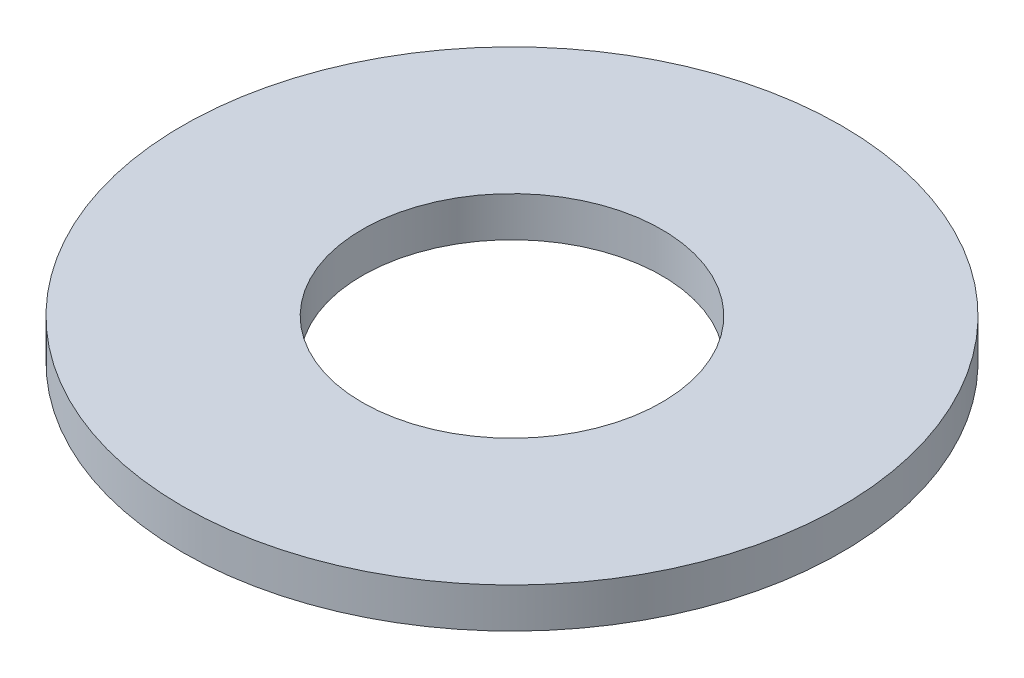
ISO-10303-21;
HEADER;
FILE_DESCRIPTION(('STEP AP214'),'2;1');
FILE_NAME('part.step','',(''),(''),'','','');
FILE_SCHEMA(('AUTOMOTIVE_DESIGN { 1 0 10303 214 1 1 1 1 }'));
ENDSEC;
DATA;
#1=APPLICATION_CONTEXT('core data for automotive mechanical design processes');
#2=APPLICATION_PROTOCOL_DEFINITION('international standard','automotive_design',2000,#1);
#3=PRODUCT_CONTEXT('',#1,'mechanical');
#4=PRODUCT('Part','Part','',(#3));
#5=PRODUCT_RELATED_PRODUCT_CATEGORY('part','',(#4));
#6=PRODUCT_DEFINITION_FORMATION('','',#4);
#7=PRODUCT_DEFINITION_CONTEXT('part definition',#1,'design');
#8=PRODUCT_DEFINITION('design','',#6,#7);
#9=PRODUCT_DEFINITION_SHAPE('','',#8);
#10=(LENGTH_UNIT() NAMED_UNIT(*) SI_UNIT(.MILLI.,.METRE.));
#11=(NAMED_UNIT(*) PLANE_ANGLE_UNIT() SI_UNIT($,.RADIAN.));
#12=(NAMED_UNIT(*) SI_UNIT($,.STERADIAN.) SOLID_ANGLE_UNIT());
#13=UNCERTAINTY_MEASURE_WITH_UNIT(LENGTH_MEASURE(1.E-05),#10,'distance_accuracy_value','');
#14=(GEOMETRIC_REPRESENTATION_CONTEXT(3) GLOBAL_UNCERTAINTY_ASSIGNED_CONTEXT((#13)) GLOBAL_UNIT_ASSIGNED_CONTEXT((#10,
#11,#12)) REPRESENTATION_CONTEXT('',''));
#15=CARTESIAN_POINT('',(0.,0.,0.));
#16=DIRECTION('',(0.,0.,1.));
#17=DIRECTION('',(1.,0.,0.));
#18=AXIS2_PLACEMENT_3D('',#15,#16,#17);
#19=CARTESIAN_POINT('',(0.,10.,0.));
#20=DIRECTION('',(0.,1.,0.));
#21=DIRECTION('',(0.,0.,1.));
#22=AXIS2_PLACEMENT_3D('',#19,#20,#21);
#23=PLANE('',#22);
#24=CARTESIAN_POINT('',(0.,10.,0.));
#25=DIRECTION('',(0.,1.,0.));
#26=DIRECTION('',(0.,0.,1.));
#27=AXIS2_PLACEMENT_3D('',#24,#25,#26);
#28=CIRCLE('',#27,82.5);
#29=CARTESIAN_POINT('',(0.,10.,82.5));
#30=VERTEX_POINT('',#29);
#31=EDGE_CURVE('E10',#30,#30,#28,.T.);
#32=ORIENTED_EDGE('',*,*,#31,.T.);
#33=EDGE_LOOP('',(#32));
#34=FACE_BOUND('',#33,.T.);
#35=CARTESIAN_POINT('',(0.,10.,0.));
#36=DIRECTION('',(0.,1.,0.));
#37=DIRECTION('',(0.,0.,1.));
#38=AXIS2_PLACEMENT_3D('',#35,#36,#37);
#39=CIRCLE('',#38,37.5);
#40=CARTESIAN_POINT('',(0.,10.,37.5));
#41=VERTEX_POINT('',#40);
#42=EDGE_CURVE('E46',#41,#41,#39,.T.);
#43=ORIENTED_EDGE('',*,*,#42,.F.);
#44=EDGE_LOOP('',(#43));
#45=FACE_BOUND('',#44,.T.);
#46=ADVANCED_FACE('F35',(#34,#45),#23,.T.);
#47=CARTESIAN_POINT('',(0.,0.,0.));
#48=DIRECTION('',(0.,1.,0.));
#49=DIRECTION('',(0.,0.,1.));
#50=AXIS2_PLACEMENT_3D('',#47,#48,#49);
#51=PLANE('',#50);
#52=CARTESIAN_POINT('',(0.,0.,0.));
#53=DIRECTION('',(0.,1.,0.));
#54=DIRECTION('',(0.,0.,1.));
#55=AXIS2_PLACEMENT_3D('',#52,#53,#54);
#56=CIRCLE('',#55,82.5);
#57=CARTESIAN_POINT('',(0.,0.,82.5));
#58=VERTEX_POINT('',#57);
#59=EDGE_CURVE('E39',#58,#58,#56,.T.);
#60=ORIENTED_EDGE('',*,*,#59,.F.);
#61=EDGE_LOOP('',(#60));
#62=FACE_BOUND('',#61,.T.);
#63=CARTESIAN_POINT('',(0.,0.,0.));
#64=DIRECTION('',(0.,1.,0.));
#65=DIRECTION('',(0.,0.,1.));
#66=AXIS2_PLACEMENT_3D('',#63,#64,#65);
#67=CIRCLE('',#66,37.5);
#68=CARTESIAN_POINT('',(0.,0.,37.5));
#69=VERTEX_POINT('',#68);
#70=EDGE_CURVE('E48',#69,#69,#67,.T.);
#71=ORIENTED_EDGE('',*,*,#70,.T.);
#72=EDGE_LOOP('',(#71));
#73=FACE_BOUND('',#72,.T.);
#74=ADVANCED_FACE('F58',(#62,#73),#51,.F.);
#75=CARTESIAN_POINT('',(0.,10.,0.));
#76=DIRECTION('',(0.,-1.,0.));
#77=DIRECTION('',(0.,0.,-1.));
#78=AXIS2_PLACEMENT_3D('',#75,#76,#77);
#79=CYLINDRICAL_SURFACE('',#78,82.5);
#80=ORIENTED_EDGE('',*,*,#31,.F.);
#81=EDGE_LOOP('',(#80));
#82=FACE_BOUND('',#81,.T.);
#83=ORIENTED_EDGE('',*,*,#59,.T.);
#84=EDGE_LOOP('',(#83));
#85=FACE_BOUND('',#84,.T.);
#86=ADVANCED_FACE('F37',(#82,#85),#79,.T.);
#87=CARTESIAN_POINT('',(0.,10.,0.));
#88=DIRECTION('',(0.,-1.,0.));
#89=DIRECTION('',(0.,0.,-1.));
#90=AXIS2_PLACEMENT_3D('',#87,#88,#89);
#91=CYLINDRICAL_SURFACE('',#90,37.5);
#92=ORIENTED_EDGE('',*,*,#42,.T.);
#93=EDGE_LOOP('',(#92));
#94=FACE_BOUND('',#93,.T.);
#95=ORIENTED_EDGE('',*,*,#70,.F.);
#96=EDGE_LOOP('',(#95));
#97=FACE_BOUND('',#96,.T.);
#98=ADVANCED_FACE('F54',(#94,#97),#91,.F.);
#99=CLOSED_SHELL('',(#46,#74,#86,#98));
#100=MANIFOLD_SOLID_BREP('B2',#99);
#101=ADVANCED_BREP_SHAPE_REPRESENTATION('',(#18,#100),#14);
#102=SHAPE_DEFINITION_REPRESENTATION(#9,#101);
ENDSEC;
END-ISO-10303-21;
